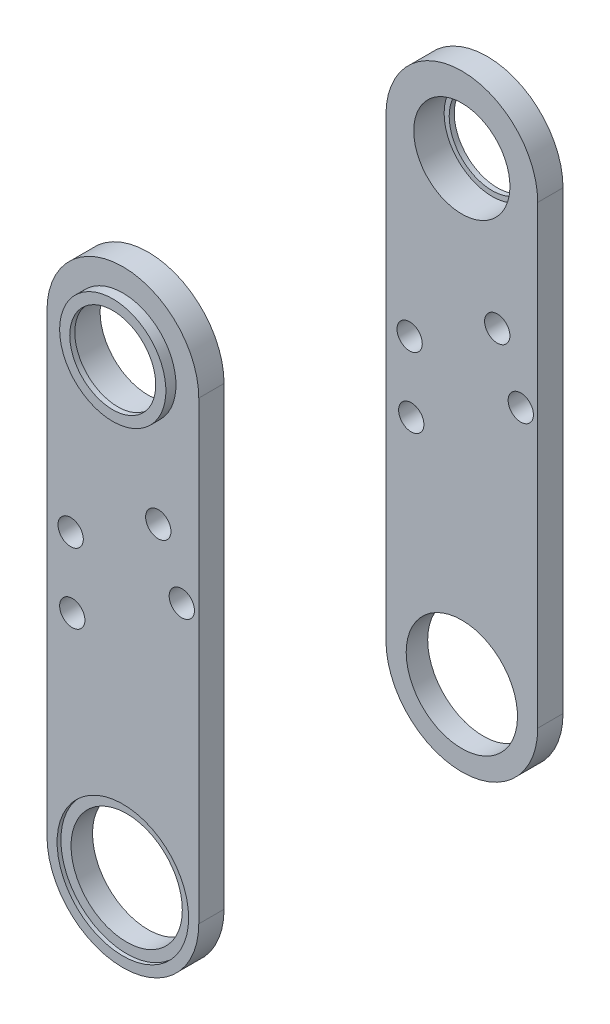
ISO-10303-21;
HEADER;
FILE_DESCRIPTION(('STEP AP214'),'2;1');
FILE_NAME('part.step','',(''),(''),'','','');
FILE_SCHEMA(('AUTOMOTIVE_DESIGN { 1 0 10303 214 1 1 1 1 }'));
ENDSEC;
DATA;
#1=APPLICATION_CONTEXT('core data for automotive mechanical design processes');
#2=APPLICATION_PROTOCOL_DEFINITION('international standard','automotive_design',2000,#1);
#3=PRODUCT_CONTEXT('',#1,'mechanical');
#4=PRODUCT('Part','Part','',(#3));
#5=PRODUCT_RELATED_PRODUCT_CATEGORY('part','',(#4));
#6=PRODUCT_DEFINITION_FORMATION('','',#4);
#7=PRODUCT_DEFINITION_CONTEXT('part definition',#1,'design');
#8=PRODUCT_DEFINITION('design','',#6,#7);
#9=PRODUCT_DEFINITION_SHAPE('','',#8);
#10=(LENGTH_UNIT() NAMED_UNIT(*) SI_UNIT(.MILLI.,.METRE.));
#11=(NAMED_UNIT(*) PLANE_ANGLE_UNIT() SI_UNIT($,.RADIAN.));
#12=(NAMED_UNIT(*) SI_UNIT($,.STERADIAN.) SOLID_ANGLE_UNIT());
#13=UNCERTAINTY_MEASURE_WITH_UNIT(LENGTH_MEASURE(1.E-05),#10,'distance_accuracy_value','');
#14=(GEOMETRIC_REPRESENTATION_CONTEXT(3) GLOBAL_UNCERTAINTY_ASSIGNED_CONTEXT((#13)) GLOBAL_UNIT_ASSIGNED_CONTEXT((#10,
#11,#12)) REPRESENTATION_CONTEXT('',''));
#15=CARTESIAN_POINT('',(0.,0.,0.));
#16=DIRECTION('',(0.,0.,1.));
#17=DIRECTION('',(1.,0.,0.));
#18=AXIS2_PLACEMENT_3D('',#15,#16,#17);
#19=CARTESIAN_POINT('',(0.,90.,0.));
#20=DIRECTION('',(0.,0.,1.));
#21=DIRECTION('',(1.,0.,0.));
#22=AXIS2_PLACEMENT_3D('',#19,#20,#21);
#23=PLANE('',#22);
#24=CARTESIAN_POINT('',(0.,90.,0.));
#25=DIRECTION('',(0.,0.,1.));
#26=DIRECTION('',(1.,0.,0.));
#27=AXIS2_PLACEMENT_3D('',#24,#25,#26);
#28=CIRCLE('',#27,15.);
#29=CARTESIAN_POINT('',(15.,90.,0.));
#30=VERTEX_POINT('',#29);
#31=CARTESIAN_POINT('',(-15.,90.,0.));
#32=VERTEX_POINT('',#31);
#33=EDGE_CURVE('E78',#30,#32,#28,.T.);
#34=ORIENTED_EDGE('',*,*,#33,.F.);
#35=DIRECTION('',(0.,1.,0.));
#36=VECTOR('',#35,1.);
#37=CARTESIAN_POINT('',(15.,90.,0.));
#38=LINE('',#37,#36);
#39=CARTESIAN_POINT('',(15.,0.,0.));
#40=VERTEX_POINT('',#39);
#41=EDGE_CURVE('E115',#40,#30,#38,.T.);
#42=ORIENTED_EDGE('',*,*,#41,.F.);
#43=CARTESIAN_POINT('',(0.,0.,0.));
#44=DIRECTION('',(0.,0.,1.));
#45=DIRECTION('',(1.,0.,0.));
#46=AXIS2_PLACEMENT_3D('',#43,#44,#45);
#47=CIRCLE('',#46,15.);
#48=CARTESIAN_POINT('',(-15.,0.,0.));
#49=VERTEX_POINT('',#48);
#50=EDGE_CURVE('E132',#49,#40,#47,.T.);
#51=ORIENTED_EDGE('',*,*,#50,.F.);
#52=DIRECTION('',(0.,-1.,0.));
#53=VECTOR('',#52,1.);
#54=CARTESIAN_POINT('',(-15.,90.,0.));
#55=LINE('',#54,#53);
#56=EDGE_CURVE('E130',#32,#49,#55,.T.);
#57=ORIENTED_EDGE('',*,*,#56,.F.);
#58=EDGE_LOOP('',(#34,#42,#51,#57));
#59=FACE_BOUND('',#58,.T.);
#60=CARTESIAN_POINT('',(11.650635094611,53.21224929608,0.));
#61=DIRECTION('',(0.,0.,-1.));
#62=DIRECTION('',(0.,1.,0.));
#63=AXIS2_PLACEMENT_3D('',#60,#61,#62);
#64=CIRCLE('',#63,2.5);
#65=CARTESIAN_POINT('',(11.650635094611,55.71224929608,0.));
#66=VERTEX_POINT('',#65);
#67=EDGE_CURVE('E156',#66,#66,#64,.T.);
#68=ORIENTED_EDGE('',*,*,#67,.F.);
#69=EDGE_LOOP('',(#68));
#70=FACE_BOUND('',#69,.T.);
#71=CARTESIAN_POINT('',(-10.,40.71224929608,0.));
#72=DIRECTION('',(0.,0.,-1.));
#73=DIRECTION('',(0.,1.,0.));
#74=AXIS2_PLACEMENT_3D('',#71,#72,#73);
#75=CIRCLE('',#74,2.5);
#76=CARTESIAN_POINT('',(-10.,43.21224929608,0.));
#77=VERTEX_POINT('',#76);
#78=EDGE_CURVE('E151',#77,#77,#75,.T.);
#79=ORIENTED_EDGE('',*,*,#78,.F.);
#80=EDGE_LOOP('',(#79));
#81=FACE_BOUND('',#80,.T.);
#82=CARTESIAN_POINT('',(-10.3205080756888,54.4114817289327,0.));
#83=DIRECTION('',(0.,0.,-1.));
#84=DIRECTION('',(0.,1.,0.));
#85=AXIS2_PLACEMENT_3D('',#82,#83,#84);
#86=CIRCLE('',#85,2.5);
#87=CARTESIAN_POINT('',(-10.3205080756888,56.9114817289327,0.));
#88=VERTEX_POINT('',#87);
#89=EDGE_CURVE('E160',#88,#88,#86,.T.);
#90=ORIENTED_EDGE('',*,*,#89,.F.);
#91=EDGE_LOOP('',(#90));
#92=FACE_BOUND('',#91,.T.);
#93=CARTESIAN_POINT('',(7.,64.4114817289327,0.));
#94=DIRECTION('',(0.,0.,-1.));
#95=DIRECTION('',(0.,1.,0.));
#96=AXIS2_PLACEMENT_3D('',#93,#94,#95);
#97=CIRCLE('',#96,2.5);
#98=CARTESIAN_POINT('',(7.,66.9114817289327,0.));
#99=VERTEX_POINT('',#98);
#100=EDGE_CURVE('E149',#99,#99,#97,.T.);
#101=ORIENTED_EDGE('',*,*,#100,.F.);
#102=EDGE_LOOP('',(#101));
#103=FACE_BOUND('',#102,.T.);
#104=CARTESIAN_POINT('',(0.,0.,0.));
#105=DIRECTION('',(0.,0.,-1.));
#106=DIRECTION('',(-1.,0.,0.));
#107=AXIS2_PLACEMENT_3D('',#104,#105,#106);
#108=CIRCLE('',#107,13.);
#109=CARTESIAN_POINT('',(-13.,0.,0.));
#110=VERTEX_POINT('',#109);
#111=EDGE_CURVE('E177',#110,#110,#108,.T.);
#112=ORIENTED_EDGE('',*,*,#111,.F.);
#113=EDGE_LOOP('',(#112));
#114=FACE_BOUND('',#113,.T.);
#115=CARTESIAN_POINT('',(0.,90.,0.));
#116=DIRECTION('',(0.,0.,1.));
#117=DIRECTION('',(1.,0.,0.));
#118=AXIS2_PLACEMENT_3D('',#115,#116,#117);
#119=CIRCLE('',#118,10.5);
#120=CARTESIAN_POINT('',(10.5,90.,0.));
#121=VERTEX_POINT('',#120);
#122=EDGE_CURVE('E13',#121,#121,#119,.F.);
#123=ORIENTED_EDGE('',*,*,#122,.F.);
#124=EDGE_LOOP('',(#123));
#125=FACE_BOUND('',#124,.T.);
#126=ADVANCED_FACE('F69',(#59,#70,#81,#92,#103,#114,#125),#23,.F.);
#127=CARTESIAN_POINT('',(0.,0.,72.));
#128=DIRECTION('',(0.,0.,-1.));
#129=DIRECTION('',(-1.,0.,0.));
#130=AXIS2_PLACEMENT_3D('',#127,#128,#129);
#131=CYLINDRICAL_SURFACE('',#130,11.);
#132=CARTESIAN_POINT('',(0.,0.,5.00000000000002));
#133=DIRECTION('',(0.,0.,-1.));
#134=DIRECTION('',(0.,1.,0.));
#135=AXIS2_PLACEMENT_3D('',#132,#133,#134);
#136=CIRCLE('',#135,11.);
#137=CARTESIAN_POINT('',(0.,11.,5.00000000000002));
#138=VERTEX_POINT('',#137);
#139=EDGE_CURVE('E126',#138,#138,#136,.T.);
#140=ORIENTED_EDGE('',*,*,#139,.F.);
#141=EDGE_LOOP('',(#140));
#142=FACE_BOUND('',#141,.T.);
#143=CARTESIAN_POINT('',(0.,0.,0.750000000000001));
#144=DIRECTION('',(0.,0.,-1.));
#145=DIRECTION('',(-1.,0.,0.));
#146=AXIS2_PLACEMENT_3D('',#143,#144,#145);
#147=CIRCLE('',#146,11.);
#148=CARTESIAN_POINT('',(-11.,0.,0.750000000000001));
#149=VERTEX_POINT('',#148);
#150=EDGE_CURVE('E168',#149,#149,#147,.T.);
#151=ORIENTED_EDGE('',*,*,#150,.T.);
#152=EDGE_LOOP('',(#151));
#153=FACE_BOUND('',#152,.T.);
#154=ADVANCED_FACE('F224',(#142,#153),#131,.F.);
#155=CARTESIAN_POINT('',(11.650635094611,53.21224929608,72.));
#156=DIRECTION('',(0.,0.,-1.));
#157=DIRECTION('',(0.,1.,0.));
#158=AXIS2_PLACEMENT_3D('',#155,#156,#157);
#159=CYLINDRICAL_SURFACE('',#158,2.5);
#160=CARTESIAN_POINT('',(11.650635094611,53.21224929608,4.99999999999999));
#161=DIRECTION('',(0.,0.,-1.));
#162=DIRECTION('',(-1.,0.,0.));
#163=AXIS2_PLACEMENT_3D('',#160,#161,#162);
#164=CIRCLE('',#163,2.5);
#165=CARTESIAN_POINT('',(9.15063509461096,53.21224929608,4.99999999999999));
#166=VERTEX_POINT('',#165);
#167=EDGE_CURVE('E159',#166,#166,#164,.F.);
#168=ORIENTED_EDGE('',*,*,#167,.T.);
#169=EDGE_LOOP('',(#168));
#170=FACE_BOUND('',#169,.T.);
#171=ORIENTED_EDGE('',*,*,#67,.T.);
#172=EDGE_LOOP('',(#171));
#173=FACE_BOUND('',#172,.T.);
#174=ADVANCED_FACE('F232',(#170,#173),#159,.F.);
#175=CARTESIAN_POINT('',(-10.,40.71224929608,72.));
#176=DIRECTION('',(0.,0.,-1.));
#177=DIRECTION('',(0.,1.,0.));
#178=AXIS2_PLACEMENT_3D('',#175,#176,#177);
#179=CYLINDRICAL_SURFACE('',#178,2.5);
#180=CARTESIAN_POINT('',(-10.,40.71224929608,4.99999999999999));
#181=DIRECTION('',(0.,0.,-1.));
#182=DIRECTION('',(-1.,0.,0.));
#183=AXIS2_PLACEMENT_3D('',#180,#181,#182);
#184=CIRCLE('',#183,2.5);
#185=CARTESIAN_POINT('',(-12.5,40.71224929608,4.99999999999999));
#186=VERTEX_POINT('',#185);
#187=EDGE_CURVE('E155',#186,#186,#184,.F.);
#188=ORIENTED_EDGE('',*,*,#187,.T.);
#189=EDGE_LOOP('',(#188));
#190=FACE_BOUND('',#189,.T.);
#191=ORIENTED_EDGE('',*,*,#78,.T.);
#192=EDGE_LOOP('',(#191));
#193=FACE_BOUND('',#192,.T.);
#194=ADVANCED_FACE('F245',(#190,#193),#179,.F.);
#195=CARTESIAN_POINT('',(-10.3205080756888,54.4114817289327,72.));
#196=DIRECTION('',(0.,0.,-1.));
#197=DIRECTION('',(0.,1.,0.));
#198=AXIS2_PLACEMENT_3D('',#195,#196,#197);
#199=CYLINDRICAL_SURFACE('',#198,2.5);
#200=CARTESIAN_POINT('',(-10.3205080756888,54.4114817289327,4.99999999999999));
#201=DIRECTION('',(0.,0.,-1.));
#202=DIRECTION('',(-1.,0.,0.));
#203=AXIS2_PLACEMENT_3D('',#200,#201,#202);
#204=CIRCLE('',#203,2.5);
#205=CARTESIAN_POINT('',(-12.8205080756888,54.4114817289327,4.99999999999999));
#206=VERTEX_POINT('',#205);
#207=EDGE_CURVE('E154',#206,#206,#204,.F.);
#208=ORIENTED_EDGE('',*,*,#207,.T.);
#209=EDGE_LOOP('',(#208));
#210=FACE_BOUND('',#209,.T.);
#211=ORIENTED_EDGE('',*,*,#89,.T.);
#212=EDGE_LOOP('',(#211));
#213=FACE_BOUND('',#212,.T.);
#214=ADVANCED_FACE('F248',(#210,#213),#199,.F.);
#215=CARTESIAN_POINT('',(7.,64.4114817289327,72.));
#216=DIRECTION('',(0.,0.,-1.));
#217=DIRECTION('',(0.,1.,0.));
#218=AXIS2_PLACEMENT_3D('',#215,#216,#217);
#219=CYLINDRICAL_SURFACE('',#218,2.5);
#220=CARTESIAN_POINT('',(7.,64.4114817289327,4.99999999999999));
#221=DIRECTION('',(0.,0.,-1.));
#222=DIRECTION('',(-1.,0.,0.));
#223=AXIS2_PLACEMENT_3D('',#220,#221,#222);
#224=CIRCLE('',#223,2.5);
#225=CARTESIAN_POINT('',(4.5,64.4114817289327,4.99999999999999));
#226=VERTEX_POINT('',#225);
#227=EDGE_CURVE('E163',#226,#226,#224,.F.);
#228=ORIENTED_EDGE('',*,*,#227,.T.);
#229=EDGE_LOOP('',(#228));
#230=FACE_BOUND('',#229,.T.);
#231=ORIENTED_EDGE('',*,*,#100,.T.);
#232=EDGE_LOOP('',(#231));
#233=FACE_BOUND('',#232,.T.);
#234=ADVANCED_FACE('F71',(#230,#233),#219,.F.);
#235=CARTESIAN_POINT('',(55.,115.,4.99999999999999));
#236=DIRECTION('',(0.,0.,-1.));
#237=DIRECTION('',(0.,1.,0.));
#238=AXIS2_PLACEMENT_3D('',#235,#236,#237);
#239=PLANE('',#238);
#240=CARTESIAN_POINT('',(0.,90.,4.99999999999999));
#241=DIRECTION('',(0.,0.,-1.));
#242=DIRECTION('',(0.,1.,0.));
#243=AXIS2_PLACEMENT_3D('',#240,#241,#242);
#244=CIRCLE('',#243,15.);
#245=CARTESIAN_POINT('',(-15.,90.,5.));
#246=VERTEX_POINT('',#245);
#247=CARTESIAN_POINT('',(15.,90.,4.99999999999999));
#248=VERTEX_POINT('',#247);
#249=EDGE_CURVE('E122',#246,#248,#244,.T.);
#250=ORIENTED_EDGE('',*,*,#249,.F.);
#251=DIRECTION('',(0.,-1.,0.));
#252=VECTOR('',#251,1.);
#253=CARTESIAN_POINT('',(-15.,115.,4.99999999999999));
#254=LINE('',#253,#252);
#255=CARTESIAN_POINT('',(-15.,0.,5.00000000000002));
#256=VERTEX_POINT('',#255);
#257=EDGE_CURVE('E119',#246,#256,#254,.T.);
#258=ORIENTED_EDGE('',*,*,#257,.T.);
#259=CARTESIAN_POINT('',(0.,0.,5.00000000000002));
#260=DIRECTION('',(0.,0.,-1.));
#261=DIRECTION('',(0.,1.,0.));
#262=AXIS2_PLACEMENT_3D('',#259,#260,#261);
#263=CIRCLE('',#262,15.);
#264=CARTESIAN_POINT('',(15.,0.,5.));
#265=VERTEX_POINT('',#264);
#266=EDGE_CURVE('E105',#265,#256,#263,.T.);
#267=ORIENTED_EDGE('',*,*,#266,.F.);
#268=DIRECTION('',(0.,-1.,0.));
#269=VECTOR('',#268,1.);
#270=CARTESIAN_POINT('',(15.,90.,4.99999999999999));
#271=LINE('',#270,#269);
#272=EDGE_CURVE('E140',#248,#265,#271,.T.);
#273=ORIENTED_EDGE('',*,*,#272,.F.);
#274=EDGE_LOOP('',(#250,#258,#267,#273));
#275=FACE_BOUND('',#274,.T.);
#276=ORIENTED_EDGE('',*,*,#139,.T.);
#277=EDGE_LOOP('',(#276));
#278=FACE_BOUND('',#277,.T.);
#279=CARTESIAN_POINT('',(0.,90.,4.99999999999999));
#280=DIRECTION('',(0.,0.,-1.));
#281=DIRECTION('',(0.,1.,0.));
#282=AXIS2_PLACEMENT_3D('',#279,#280,#281);
#283=CIRCLE('',#282,9.5);
#284=CARTESIAN_POINT('',(0.,99.5,4.99999999999999));
#285=VERTEX_POINT('',#284);
#286=EDGE_CURVE('E125',#285,#285,#283,.T.);
#287=ORIENTED_EDGE('',*,*,#286,.T.);
#288=EDGE_LOOP('',(#287));
#289=FACE_BOUND('',#288,.T.);
#290=ORIENTED_EDGE('',*,*,#167,.F.);
#291=EDGE_LOOP('',(#290));
#292=FACE_BOUND('',#291,.T.);
#293=ORIENTED_EDGE('',*,*,#187,.F.);
#294=EDGE_LOOP('',(#293));
#295=FACE_BOUND('',#294,.T.);
#296=ORIENTED_EDGE('',*,*,#227,.F.);
#297=EDGE_LOOP('',(#296));
#298=FACE_BOUND('',#297,.T.);
#299=ORIENTED_EDGE('',*,*,#207,.F.);
#300=EDGE_LOOP('',(#299));
#301=FACE_BOUND('',#300,.T.);
#302=ADVANCED_FACE('F120',(#275,#278,#289,#292,#295,#298,#301),#239,.F.);
#303=CARTESIAN_POINT('',(15.,90.,72.));
#304=DIRECTION('',(-1.,0.,0.));
#305=DIRECTION('',(0.,-1.,0.));
#306=AXIS2_PLACEMENT_3D('',#303,#304,#305);
#307=PLANE('',#306);
#308=DIRECTION('',(0.,0.,-1.));
#309=VECTOR('',#308,1.);
#310=CARTESIAN_POINT('',(15.,90.,72.));
#311=LINE('',#310,#309);
#312=EDGE_CURVE('E86',#248,#30,#311,.T.);
#313=ORIENTED_EDGE('',*,*,#312,.F.);
#314=ORIENTED_EDGE('',*,*,#272,.T.);
#315=DIRECTION('',(0.,0.,-1.));
#316=VECTOR('',#315,1.);
#317=CARTESIAN_POINT('',(15.,0.,72.));
#318=LINE('',#317,#316);
#319=EDGE_CURVE('E112',#265,#40,#318,.T.);
#320=ORIENTED_EDGE('',*,*,#319,.T.);
#321=ORIENTED_EDGE('',*,*,#41,.T.);
#322=EDGE_LOOP('',(#313,#314,#320,#321));
#323=FACE_BOUND('',#322,.T.);
#324=ADVANCED_FACE('F238',(#323),#307,.F.);
#325=CARTESIAN_POINT('',(0.,0.,72.));
#326=DIRECTION('',(0.,0.,-1.));
#327=DIRECTION('',(-1.,0.,0.));
#328=AXIS2_PLACEMENT_3D('',#325,#326,#327);
#329=CYLINDRICAL_SURFACE('',#328,15.);
#330=ORIENTED_EDGE('',*,*,#319,.F.);
#331=ORIENTED_EDGE('',*,*,#266,.T.);
#332=DIRECTION('',(0.,0.,-1.));
#333=VECTOR('',#332,1.);
#334=CARTESIAN_POINT('',(-15.,0.,72.));
#335=LINE('',#334,#333);
#336=EDGE_CURVE('E110',#256,#49,#335,.T.);
#337=ORIENTED_EDGE('',*,*,#336,.T.);
#338=ORIENTED_EDGE('',*,*,#50,.T.);
#339=EDGE_LOOP('',(#330,#331,#337,#338));
#340=FACE_BOUND('',#339,.T.);
#341=ADVANCED_FACE('F107',(#340),#329,.T.);
#342=CARTESIAN_POINT('',(-15.,90.,72.));
#343=DIRECTION('',(1.,0.,0.));
#344=DIRECTION('',(0.,1.,0.));
#345=AXIS2_PLACEMENT_3D('',#342,#343,#344);
#346=PLANE('',#345);
#347=ORIENTED_EDGE('',*,*,#336,.F.);
#348=ORIENTED_EDGE('',*,*,#257,.F.);
#349=DIRECTION('',(0.,0.,-1.));
#350=VECTOR('',#349,1.);
#351=CARTESIAN_POINT('',(-15.,90.,72.));
#352=LINE('',#351,#350);
#353=EDGE_CURVE('E134',#246,#32,#352,.T.);
#354=ORIENTED_EDGE('',*,*,#353,.T.);
#355=ORIENTED_EDGE('',*,*,#56,.T.);
#356=EDGE_LOOP('',(#347,#348,#354,#355));
#357=FACE_BOUND('',#356,.T.);
#358=ADVANCED_FACE('F128',(#357),#346,.F.);
#359=CARTESIAN_POINT('',(0.,90.,72.));
#360=DIRECTION('',(0.,0.,-1.));
#361=DIRECTION('',(-1.,0.,0.));
#362=AXIS2_PLACEMENT_3D('',#359,#360,#361);
#363=CYLINDRICAL_SURFACE('',#362,15.);
#364=ORIENTED_EDGE('',*,*,#353,.F.);
#365=ORIENTED_EDGE('',*,*,#249,.T.);
#366=ORIENTED_EDGE('',*,*,#312,.T.);
#367=ORIENTED_EDGE('',*,*,#33,.T.);
#368=EDGE_LOOP('',(#364,#365,#366,#367));
#369=FACE_BOUND('',#368,.T.);
#370=ADVANCED_FACE('F197',(#369),#363,.T.);
#371=CARTESIAN_POINT('',(0.,90.,72.));
#372=DIRECTION('',(0.,0.,-1.));
#373=DIRECTION('',(-1.,0.,0.));
#374=AXIS2_PLACEMENT_3D('',#371,#372,#373);
#375=CYLINDRICAL_SURFACE('',#374,9.5);
#376=ORIENTED_EDGE('',*,*,#286,.F.);
#377=EDGE_LOOP('',(#376));
#378=FACE_BOUND('',#377,.T.);
#379=CARTESIAN_POINT('',(0.,90.,-1.));
#380=DIRECTION('',(0.,0.,-1.));
#381=DIRECTION('',(-1.,0.,0.));
#382=AXIS2_PLACEMENT_3D('',#379,#380,#381);
#383=CIRCLE('',#382,9.49999999999999);
#384=CARTESIAN_POINT('',(-9.49999999999999,90.,-1.));
#385=VERTEX_POINT('',#384);
#386=EDGE_CURVE('E201',#385,#385,#383,.T.);
#387=ORIENTED_EDGE('',*,*,#386,.T.);
#388=EDGE_LOOP('',(#387));
#389=FACE_BOUND('',#388,.T.);
#390=ADVANCED_FACE('F193',(#378,#389),#375,.F.);
#391=CARTESIAN_POINT('',(0.,0.,0.75));
#392=DIRECTION('',(0.,0.,-1.));
#393=DIRECTION('',(-1.,0.,0.));
#394=AXIS2_PLACEMENT_3D('',#391,#392,#393);
#395=CYLINDRICAL_SURFACE('',#394,13.);
#396=CARTESIAN_POINT('',(0.,0.,0.75));
#397=DIRECTION('',(0.,0.,-1.));
#398=DIRECTION('',(-1.,0.,0.));
#399=AXIS2_PLACEMENT_3D('',#396,#397,#398);
#400=CIRCLE('',#399,13.);
#401=CARTESIAN_POINT('',(-13.,0.,0.75));
#402=VERTEX_POINT('',#401);
#403=EDGE_CURVE('E173',#402,#402,#400,.T.);
#404=ORIENTED_EDGE('',*,*,#403,.F.);
#405=EDGE_LOOP('',(#404));
#406=FACE_BOUND('',#405,.T.);
#407=ORIENTED_EDGE('',*,*,#111,.T.);
#408=EDGE_LOOP('',(#407));
#409=FACE_BOUND('',#408,.T.);
#410=ADVANCED_FACE('F196',(#406,#409),#395,.F.);
#411=CARTESIAN_POINT('',(0.,0.,0.75));
#412=DIRECTION('',(0.,0.,-1.));
#413=DIRECTION('',(-1.,0.,0.));
#414=AXIS2_PLACEMENT_3D('',#411,#412,#413);
#415=PLANE('',#414);
#416=ORIENTED_EDGE('',*,*,#150,.F.);
#417=EDGE_LOOP('',(#416));
#418=FACE_BOUND('',#417,.T.);
#419=ORIENTED_EDGE('',*,*,#403,.T.);
#420=EDGE_LOOP('',(#419));
#421=FACE_BOUND('',#420,.T.);
#422=ADVANCED_FACE('F219',(#418,#421),#415,.T.);
#423=CARTESIAN_POINT('',(0.,90.,67.));
#424=DIRECTION('',(0.,0.,-1.));
#425=DIRECTION('',(-1.,0.,0.));
#426=AXIS2_PLACEMENT_3D('',#423,#424,#425);
#427=CYLINDRICAL_SURFACE('',#426,10.5);
#428=CARTESIAN_POINT('',(0.,90.,-2.));
#429=DIRECTION('',(0.,0.,-1.));
#430=DIRECTION('',(-1.,0.,0.));
#431=AXIS2_PLACEMENT_3D('',#428,#429,#430);
#432=CIRCLE('',#431,10.5);
#433=CARTESIAN_POINT('',(-10.5,90.,-2.));
#434=VERTEX_POINT('',#433);
#435=EDGE_CURVE('E182',#434,#434,#432,.T.);
#436=ORIENTED_EDGE('',*,*,#435,.F.);
#437=EDGE_LOOP('',(#436));
#438=FACE_BOUND('',#437,.T.);
#439=ORIENTED_EDGE('',*,*,#122,.T.);
#440=EDGE_LOOP('',(#439));
#441=FACE_BOUND('',#440,.T.);
#442=ADVANCED_FACE('F216',(#438,#441),#427,.T.);
#443=CARTESIAN_POINT('',(0.,79.5,-2.));
#444=DIRECTION('',(0.,0.,1.));
#445=DIRECTION('',(1.,0.,0.));
#446=AXIS2_PLACEMENT_3D('',#443,#444,#445);
#447=PLANE('',#446);
#448=CARTESIAN_POINT('',(0.,90.,-2.));
#449=DIRECTION('',(0.,0.,-1.));
#450=DIRECTION('',(-1.,0.,0.));
#451=AXIS2_PLACEMENT_3D('',#448,#449,#450);
#452=CIRCLE('',#451,8.50000000000001);
#453=CARTESIAN_POINT('',(-8.50000000000001,90.,-2.));
#454=VERTEX_POINT('',#453);
#455=EDGE_CURVE('E206',#454,#454,#452,.T.);
#456=ORIENTED_EDGE('',*,*,#455,.F.);
#457=EDGE_LOOP('',(#456));
#458=FACE_BOUND('',#457,.T.);
#459=ORIENTED_EDGE('',*,*,#435,.T.);
#460=EDGE_LOOP('',(#459));
#461=FACE_BOUND('',#460,.T.);
#462=ADVANCED_FACE('F214',(#458,#461),#447,.F.);
#463=CARTESIAN_POINT('',(0.,90.,67.));
#464=DIRECTION('',(0.,0.,-1.));
#465=DIRECTION('',(-1.,0.,0.));
#466=AXIS2_PLACEMENT_3D('',#463,#464,#465);
#467=CYLINDRICAL_SURFACE('',#466,8.50000000000001);
#468=CARTESIAN_POINT('',(0.,90.,-1.));
#469=DIRECTION('',(0.,0.,-1.));
#470=DIRECTION('',(-1.,0.,0.));
#471=AXIS2_PLACEMENT_3D('',#468,#469,#470);
#472=CIRCLE('',#471,8.50000000000001);
#473=CARTESIAN_POINT('',(-8.50000000000001,90.,-1.));
#474=VERTEX_POINT('',#473);
#475=EDGE_CURVE('E203',#474,#474,#472,.T.);
#476=ORIENTED_EDGE('',*,*,#475,.F.);
#477=EDGE_LOOP('',(#476));
#478=FACE_BOUND('',#477,.T.);
#479=ORIENTED_EDGE('',*,*,#455,.T.);
#480=EDGE_LOOP('',(#479));
#481=FACE_BOUND('',#480,.T.);
#482=ADVANCED_FACE('F348',(#478,#481),#467,.F.);
#483=CARTESIAN_POINT('',(0.,81.5,-0.999999999999999));
#484=DIRECTION('',(0.,0.,-1.));
#485=DIRECTION('',(-1.,0.,0.));
#486=AXIS2_PLACEMENT_3D('',#483,#484,#485);
#487=PLANE('',#486);
#488=ORIENTED_EDGE('',*,*,#386,.F.);
#489=EDGE_LOOP('',(#488));
#490=FACE_BOUND('',#489,.T.);
#491=ORIENTED_EDGE('',*,*,#475,.T.);
#492=EDGE_LOOP('',(#491));
#493=FACE_BOUND('',#492,.T.);
#494=ADVANCED_FACE('F356',(#490,#493),#487,.F.);
#495=CLOSED_SHELL('',(#126,#154,#174,#194,#214,#234,#302,#324,#341,#358,#370,#390,#410,#422,
#442,#462,#482,#494));
#496=MANIFOLD_SOLID_BREP('B2',#495);
#497=CARTESIAN_POINT('',(0.,90.,72.));
#498=DIRECTION('',(0.,0.,1.));
#499=DIRECTION('',(1.,0.,0.));
#500=AXIS2_PLACEMENT_3D('',#497,#498,#499);
#501=PLANE('',#500);
#502=CARTESIAN_POINT('',(0.,90.,72.));
#503=DIRECTION('',(0.,0.,1.));
#504=DIRECTION('',(1.,0.,0.));
#505=AXIS2_PLACEMENT_3D('',#502,#503,#504);
#506=CIRCLE('',#505,15.);
#507=CARTESIAN_POINT('',(15.,90.,72.));
#508=VERTEX_POINT('',#507);
#509=CARTESIAN_POINT('',(-15.,90.,72.));
#510=VERTEX_POINT('',#509);
#511=EDGE_CURVE('E478',#508,#510,#506,.T.);
#512=ORIENTED_EDGE('',*,*,#511,.T.);
#513=DIRECTION('',(0.,-1.,0.));
#514=VECTOR('',#513,1.);
#515=CARTESIAN_POINT('',(-15.,90.,72.));
#516=LINE('',#515,#514);
#517=CARTESIAN_POINT('',(-15.,0.,72.));
#518=VERTEX_POINT('',#517);
#519=EDGE_CURVE('E532',#510,#518,#516,.T.);
#520=ORIENTED_EDGE('',*,*,#519,.T.);
#521=CARTESIAN_POINT('',(0.,0.,72.));
#522=DIRECTION('',(0.,0.,1.));
#523=DIRECTION('',(1.,0.,0.));
#524=AXIS2_PLACEMENT_3D('',#521,#522,#523);
#525=CIRCLE('',#524,15.);
#526=CARTESIAN_POINT('',(15.,0.,72.));
#527=VERTEX_POINT('',#526);
#528=EDGE_CURVE('E530',#518,#527,#525,.T.);
#529=ORIENTED_EDGE('',*,*,#528,.T.);
#530=DIRECTION('',(0.,1.,0.));
#531=VECTOR('',#530,1.);
#532=CARTESIAN_POINT('',(15.,90.,72.));
#533=LINE('',#532,#531);
#534=EDGE_CURVE('E464',#527,#508,#533,.T.);
#535=ORIENTED_EDGE('',*,*,#534,.T.);
#536=EDGE_LOOP('',(#512,#520,#529,#535));
#537=FACE_BOUND('',#536,.T.);
#538=CARTESIAN_POINT('',(11.650635094611,53.21224929608,72.));
#539=DIRECTION('',(0.,0.,-1.));
#540=DIRECTION('',(0.,1.,0.));
#541=AXIS2_PLACEMENT_3D('',#538,#539,#540);
#542=CIRCLE('',#541,2.5);
#543=CARTESIAN_POINT('',(11.650635094611,55.71224929608,72.));
#544=VERTEX_POINT('',#543);
#545=EDGE_CURVE('E485',#544,#544,#542,.T.);
#546=ORIENTED_EDGE('',*,*,#545,.T.);
#547=EDGE_LOOP('',(#546));
#548=FACE_BOUND('',#547,.T.);
#549=CARTESIAN_POINT('',(-10.,40.71224929608,72.));
#550=DIRECTION('',(0.,0.,-1.));
#551=DIRECTION('',(0.,1.,0.));
#552=AXIS2_PLACEMENT_3D('',#549,#550,#551);
#553=CIRCLE('',#552,2.5);
#554=CARTESIAN_POINT('',(-10.,43.2122492960801,72.));
#555=VERTEX_POINT('',#554);
#556=EDGE_CURVE('E520',#555,#555,#553,.T.);
#557=ORIENTED_EDGE('',*,*,#556,.T.);
#558=EDGE_LOOP('',(#557));
#559=FACE_BOUND('',#558,.T.);
#560=CARTESIAN_POINT('',(-10.3205080756888,54.4114817289327,72.));
#561=DIRECTION('',(0.,0.,-1.));
#562=DIRECTION('',(0.,1.,0.));
#563=AXIS2_PLACEMENT_3D('',#560,#561,#562);
#564=CIRCLE('',#563,2.5);
#565=CARTESIAN_POINT('',(-10.3205080756888,56.9114817289327,72.));
#566=VERTEX_POINT('',#565);
#567=EDGE_CURVE('E516',#566,#566,#564,.T.);
#568=ORIENTED_EDGE('',*,*,#567,.T.);
#569=EDGE_LOOP('',(#568));
#570=FACE_BOUND('',#569,.T.);
#571=CARTESIAN_POINT('',(7.,64.4114817289327,72.));
#572=DIRECTION('',(0.,0.,-1.));
#573=DIRECTION('',(0.,1.,0.));
#574=AXIS2_PLACEMENT_3D('',#571,#572,#573);
#575=CIRCLE('',#574,2.5);
#576=CARTESIAN_POINT('',(7.,66.9114817289327,72.));
#577=VERTEX_POINT('',#576);
#578=EDGE_CURVE('E480',#577,#577,#575,.T.);
#579=ORIENTED_EDGE('',*,*,#578,.T.);
#580=EDGE_LOOP('',(#579));
#581=FACE_BOUND('',#580,.T.);
#582=CARTESIAN_POINT('',(0.,0.,72.));
#583=DIRECTION('',(0.,0.,1.));
#584=DIRECTION('',(1.,0.,0.));
#585=AXIS2_PLACEMENT_3D('',#582,#583,#584);
#586=CIRCLE('',#585,13.);
#587=CARTESIAN_POINT('',(13.,0.,72.));
#588=VERTEX_POINT('',#587);
#589=EDGE_CURVE('E502',#588,#588,#586,.T.);
#590=ORIENTED_EDGE('',*,*,#589,.F.);
#591=EDGE_LOOP('',(#590));
#592=FACE_BOUND('',#591,.T.);
#593=CARTESIAN_POINT('',(0.,90.,72.));
#594=DIRECTION('',(0.,0.,-1.));
#595=DIRECTION('',(-1.,0.,0.));
#596=AXIS2_PLACEMENT_3D('',#593,#594,#595);
#597=CIRCLE('',#596,10.5);
#598=CARTESIAN_POINT('',(-10.5,90.,72.));
#599=VERTEX_POINT('',#598);
#600=EDGE_CURVE('E507',#599,#599,#597,.T.);
#601=ORIENTED_EDGE('',*,*,#600,.T.);
#602=EDGE_LOOP('',(#601));
#603=FACE_BOUND('',#602,.T.);
#604=ADVANCED_FACE('F418',(#537,#548,#559,#570,#581,#592,#603),#501,.T.);
#605=CARTESIAN_POINT('',(0.,0.,72.));
#606=DIRECTION('',(0.,0.,-1.));
#607=DIRECTION('',(-1.,0.,0.));
#608=AXIS2_PLACEMENT_3D('',#605,#606,#607);
#609=CYLINDRICAL_SURFACE('',#608,11.);
#610=CARTESIAN_POINT('',(0.,0.,67.));
#611=DIRECTION('',(0.,0.,-1.));
#612=DIRECTION('',(-1.,0.,0.));
#613=AXIS2_PLACEMENT_3D('',#610,#611,#612);
#614=CIRCLE('',#613,11.);
#615=CARTESIAN_POINT('',(-11.,0.,67.));
#616=VERTEX_POINT('',#615);
#617=EDGE_CURVE('E528',#616,#616,#614,.T.);
#618=ORIENTED_EDGE('',*,*,#617,.T.);
#619=EDGE_LOOP('',(#618));
#620=FACE_BOUND('',#619,.T.);
#621=CARTESIAN_POINT('',(0.,0.,71.25));
#622=DIRECTION('',(0.,0.,1.));
#623=DIRECTION('',(1.,0.,0.));
#624=AXIS2_PLACEMENT_3D('',#621,#622,#623);
#625=CIRCLE('',#624,11.);
#626=CARTESIAN_POINT('',(11.,0.,71.25));
#627=VERTEX_POINT('',#626);
#628=EDGE_CURVE('E422',#627,#627,#625,.T.);
#629=ORIENTED_EDGE('',*,*,#628,.T.);
#630=EDGE_LOOP('',(#629));
#631=FACE_BOUND('',#630,.T.);
#632=ADVANCED_FACE('F545',(#620,#631),#609,.F.);
#633=CARTESIAN_POINT('',(0.,0.,72.));
#634=DIRECTION('',(0.,0.,-1.));
#635=DIRECTION('',(-1.,0.,0.));
#636=AXIS2_PLACEMENT_3D('',#633,#634,#635);
#637=CYLINDRICAL_SURFACE('',#636,15.);
#638=CARTESIAN_POINT('',(0.,0.,67.));
#639=DIRECTION('',(0.,0.,-1.));
#640=DIRECTION('',(-1.,0.,0.));
#641=AXIS2_PLACEMENT_3D('',#638,#639,#640);
#642=CIRCLE('',#641,15.);
#643=CARTESIAN_POINT('',(15.,0.,67.));
#644=VERTEX_POINT('',#643);
#645=CARTESIAN_POINT('',(-15.,0.,67.));
#646=VERTEX_POINT('',#645);
#647=EDGE_CURVE('E427',#644,#646,#642,.T.);
#648=ORIENTED_EDGE('',*,*,#647,.F.);
#649=DIRECTION('',(0.,0.,-1.));
#650=VECTOR('',#649,1.);
#651=CARTESIAN_POINT('',(15.,0.,72.));
#652=LINE('',#651,#650);
#653=EDGE_CURVE('E474',#527,#644,#652,.T.);
#654=ORIENTED_EDGE('',*,*,#653,.F.);
#655=ORIENTED_EDGE('',*,*,#528,.F.);
#656=DIRECTION('',(0.,0.,-1.));
#657=VECTOR('',#656,1.);
#658=CARTESIAN_POINT('',(-15.,0.,72.));
#659=LINE('',#658,#657);
#660=EDGE_CURVE('E482',#518,#646,#659,.T.);
#661=ORIENTED_EDGE('',*,*,#660,.T.);
#662=EDGE_LOOP('',(#648,#654,#655,#661));
#663=FACE_BOUND('',#662,.T.);
#664=ADVANCED_FACE('F540',(#663),#637,.T.);
#665=CARTESIAN_POINT('',(0.,90.,72.));
#666=DIRECTION('',(0.,0.,-1.));
#667=DIRECTION('',(-1.,0.,0.));
#668=AXIS2_PLACEMENT_3D('',#665,#666,#667);
#669=CYLINDRICAL_SURFACE('',#668,15.);
#670=CARTESIAN_POINT('',(0.,90.,67.));
#671=DIRECTION('',(0.,0.,-1.));
#672=DIRECTION('',(-1.,0.,0.));
#673=AXIS2_PLACEMENT_3D('',#670,#671,#672);
#674=CIRCLE('',#673,15.);
#675=CARTESIAN_POINT('',(-15.,90.,67.));
#676=VERTEX_POINT('',#675);
#677=CARTESIAN_POINT('',(15.,90.,67.));
#678=VERTEX_POINT('',#677);
#679=EDGE_CURVE('E455',#676,#678,#674,.T.);
#680=ORIENTED_EDGE('',*,*,#679,.F.);
#681=DIRECTION('',(0.,0.,-1.));
#682=VECTOR('',#681,1.);
#683=CARTESIAN_POINT('',(-15.,90.,72.));
#684=LINE('',#683,#682);
#685=EDGE_CURVE('E479',#510,#676,#684,.T.);
#686=ORIENTED_EDGE('',*,*,#685,.F.);
#687=ORIENTED_EDGE('',*,*,#511,.F.);
#688=DIRECTION('',(0.,0.,-1.));
#689=VECTOR('',#688,1.);
#690=CARTESIAN_POINT('',(15.,90.,72.));
#691=LINE('',#690,#689);
#692=EDGE_CURVE('E471',#508,#678,#691,.T.);
#693=ORIENTED_EDGE('',*,*,#692,.T.);
#694=EDGE_LOOP('',(#680,#686,#687,#693));
#695=FACE_BOUND('',#694,.T.);
#696=ADVANCED_FACE('F476',(#695),#669,.T.);
#697=CARTESIAN_POINT('',(0.,90.,72.));
#698=DIRECTION('',(0.,0.,-1.));
#699=DIRECTION('',(-1.,0.,0.));
#700=AXIS2_PLACEMENT_3D('',#697,#698,#699);
#701=CYLINDRICAL_SURFACE('',#700,9.5);
#702=CARTESIAN_POINT('',(0.,90.,67.));
#703=DIRECTION('',(0.,0.,-1.));
#704=DIRECTION('',(-1.,0.,0.));
#705=AXIS2_PLACEMENT_3D('',#702,#703,#704);
#706=CIRCLE('',#705,9.5);
#707=CARTESIAN_POINT('',(-9.5,90.,67.));
#708=VERTEX_POINT('',#707);
#709=EDGE_CURVE('E525',#708,#708,#706,.T.);
#710=ORIENTED_EDGE('',*,*,#709,.T.);
#711=EDGE_LOOP('',(#710));
#712=FACE_BOUND('',#711,.T.);
#713=CARTESIAN_POINT('',(0.,90.,73.));
#714=DIRECTION('',(0.,0.,-1.));
#715=DIRECTION('',(-1.,0.,0.));
#716=AXIS2_PLACEMENT_3D('',#713,#714,#715);
#717=CIRCLE('',#716,9.49999999999999);
#718=CARTESIAN_POINT('',(-9.49999999999999,90.,73.));
#719=VERTEX_POINT('',#718);
#720=EDGE_CURVE('E571',#719,#719,#717,.T.);
#721=ORIENTED_EDGE('',*,*,#720,.F.);
#722=EDGE_LOOP('',(#721));
#723=FACE_BOUND('',#722,.T.);
#724=ADVANCED_FACE('F420',(#712,#723),#701,.F.);
#725=CARTESIAN_POINT('',(55.,115.,67.));
#726=DIRECTION('',(0.,0.,-1.));
#727=DIRECTION('',(-1.,0.,0.));
#728=AXIS2_PLACEMENT_3D('',#725,#726,#727);
#729=PLANE('',#728);
#730=ORIENTED_EDGE('',*,*,#647,.T.);
#731=DIRECTION('',(0.,-1.,0.));
#732=VECTOR('',#731,1.);
#733=CARTESIAN_POINT('',(-15.,115.,67.));
#734=LINE('',#733,#732);
#735=EDGE_CURVE('E67',#676,#646,#734,.T.);
#736=ORIENTED_EDGE('',*,*,#735,.F.);
#737=ORIENTED_EDGE('',*,*,#679,.T.);
#738=DIRECTION('',(0.,-1.,0.));
#739=VECTOR('',#738,1.);
#740=CARTESIAN_POINT('',(15.,90.,67.));
#741=LINE('',#740,#739);
#742=EDGE_CURVE('E459',#678,#644,#741,.T.);
#743=ORIENTED_EDGE('',*,*,#742,.T.);
#744=EDGE_LOOP('',(#730,#736,#737,#743));
#745=FACE_BOUND('',#744,.T.);
#746=ORIENTED_EDGE('',*,*,#709,.F.);
#747=EDGE_LOOP('',(#746));
#748=FACE_BOUND('',#747,.T.);
#749=CARTESIAN_POINT('',(11.650635094611,53.21224929608,67.));
#750=DIRECTION('',(0.,0.,1.));
#751=DIRECTION('',(1.,0.,0.));
#752=AXIS2_PLACEMENT_3D('',#749,#750,#751);
#753=CIRCLE('',#752,2.5);
#754=CARTESIAN_POINT('',(14.150635094611,53.21224929608,67.));
#755=VERTEX_POINT('',#754);
#756=EDGE_CURVE('E514',#755,#755,#753,.F.);
#757=ORIENTED_EDGE('',*,*,#756,.F.);
#758=EDGE_LOOP('',(#757));
#759=FACE_BOUND('',#758,.T.);
#760=CARTESIAN_POINT('',(-10.,40.71224929608,67.));
#761=DIRECTION('',(0.,0.,1.));
#762=DIRECTION('',(1.,0.,0.));
#763=AXIS2_PLACEMENT_3D('',#760,#761,#762);
#764=CIRCLE('',#763,2.5);
#765=CARTESIAN_POINT('',(-7.50000000000001,40.71224929608,67.));
#766=VERTEX_POINT('',#765);
#767=EDGE_CURVE('E495',#766,#766,#764,.F.);
#768=ORIENTED_EDGE('',*,*,#767,.F.);
#769=EDGE_LOOP('',(#768));
#770=FACE_BOUND('',#769,.T.);
#771=ORIENTED_EDGE('',*,*,#617,.F.);
#772=EDGE_LOOP('',(#771));
#773=FACE_BOUND('',#772,.T.);
#774=CARTESIAN_POINT('',(7.,64.4114817289327,67.));
#775=DIRECTION('',(0.,0.,1.));
#776=DIRECTION('',(1.,0.,0.));
#777=AXIS2_PLACEMENT_3D('',#774,#775,#776);
#778=CIRCLE('',#777,2.5);
#779=CARTESIAN_POINT('',(9.5,64.4114817289327,67.));
#780=VERTEX_POINT('',#779);
#781=EDGE_CURVE('E489',#780,#780,#778,.F.);
#782=ORIENTED_EDGE('',*,*,#781,.F.);
#783=EDGE_LOOP('',(#782));
#784=FACE_BOUND('',#783,.T.);
#785=CARTESIAN_POINT('',(-10.3205080756888,54.4114817289327,67.));
#786=DIRECTION('',(0.,0.,1.));
#787=DIRECTION('',(1.,0.,0.));
#788=AXIS2_PLACEMENT_3D('',#785,#786,#787);
#789=CIRCLE('',#788,2.5);
#790=CARTESIAN_POINT('',(-7.82050807568877,54.4114817289327,67.));
#791=VERTEX_POINT('',#790);
#792=EDGE_CURVE('E491',#791,#791,#789,.F.);
#793=ORIENTED_EDGE('',*,*,#792,.F.);
#794=EDGE_LOOP('',(#793));
#795=FACE_BOUND('',#794,.T.);
#796=ADVANCED_FACE('F457',(#745,#748,#759,#770,#773,#784,#795),#729,.T.);
#797=CARTESIAN_POINT('',(15.,90.,72.));
#798=DIRECTION('',(-1.,0.,0.));
#799=DIRECTION('',(0.,-1.,0.));
#800=AXIS2_PLACEMENT_3D('',#797,#798,#799);
#801=PLANE('',#800);
#802=ORIENTED_EDGE('',*,*,#742,.F.);
#803=ORIENTED_EDGE('',*,*,#692,.F.);
#804=ORIENTED_EDGE('',*,*,#534,.F.);
#805=ORIENTED_EDGE('',*,*,#653,.T.);
#806=EDGE_LOOP('',(#802,#803,#804,#805));
#807=FACE_BOUND('',#806,.T.);
#808=ADVANCED_FACE('F469',(#807),#801,.F.);
#809=CARTESIAN_POINT('',(-15.,90.,72.));
#810=DIRECTION('',(1.,0.,0.));
#811=DIRECTION('',(0.,1.,0.));
#812=AXIS2_PLACEMENT_3D('',#809,#810,#811);
#813=PLANE('',#812);
#814=ORIENTED_EDGE('',*,*,#685,.T.);
#815=ORIENTED_EDGE('',*,*,#735,.T.);
#816=ORIENTED_EDGE('',*,*,#660,.F.);
#817=ORIENTED_EDGE('',*,*,#519,.F.);
#818=EDGE_LOOP('',(#814,#815,#816,#817));
#819=FACE_BOUND('',#818,.T.);
#820=ADVANCED_FACE('F541',(#819),#813,.F.);
#821=CARTESIAN_POINT('',(11.650635094611,53.21224929608,72.));
#822=DIRECTION('',(0.,0.,-1.));
#823=DIRECTION('',(0.,1.,0.));
#824=AXIS2_PLACEMENT_3D('',#821,#822,#823);
#825=CYLINDRICAL_SURFACE('',#824,2.5);
#826=ORIENTED_EDGE('',*,*,#756,.T.);
#827=EDGE_LOOP('',(#826));
#828=FACE_BOUND('',#827,.T.);
#829=ORIENTED_EDGE('',*,*,#545,.F.);
#830=EDGE_LOOP('',(#829));
#831=FACE_BOUND('',#830,.T.);
#832=ADVANCED_FACE('F609',(#828,#831),#825,.F.);
#833=CARTESIAN_POINT('',(-10.,40.71224929608,72.));
#834=DIRECTION('',(0.,0.,-1.));
#835=DIRECTION('',(0.,1.,0.));
#836=AXIS2_PLACEMENT_3D('',#833,#834,#835);
#837=CYLINDRICAL_SURFACE('',#836,2.5);
#838=ORIENTED_EDGE('',*,*,#767,.T.);
#839=EDGE_LOOP('',(#838));
#840=FACE_BOUND('',#839,.T.);
#841=ORIENTED_EDGE('',*,*,#556,.F.);
#842=EDGE_LOOP('',(#841));
#843=FACE_BOUND('',#842,.T.);
#844=ADVANCED_FACE('F601',(#840,#843),#837,.F.);
#845=CARTESIAN_POINT('',(-10.3205080756888,54.4114817289327,72.));
#846=DIRECTION('',(0.,0.,-1.));
#847=DIRECTION('',(0.,1.,0.));
#848=AXIS2_PLACEMENT_3D('',#845,#846,#847);
#849=CYLINDRICAL_SURFACE('',#848,2.5);
#850=ORIENTED_EDGE('',*,*,#792,.T.);
#851=EDGE_LOOP('',(#850));
#852=FACE_BOUND('',#851,.T.);
#853=ORIENTED_EDGE('',*,*,#567,.F.);
#854=EDGE_LOOP('',(#853));
#855=FACE_BOUND('',#854,.T.);
#856=ADVANCED_FACE('F597',(#852,#855),#849,.F.);
#857=CARTESIAN_POINT('',(7.,64.4114817289327,72.));
#858=DIRECTION('',(0.,0.,-1.));
#859=DIRECTION('',(0.,1.,0.));
#860=AXIS2_PLACEMENT_3D('',#857,#858,#859);
#861=CYLINDRICAL_SURFACE('',#860,2.5);
#862=ORIENTED_EDGE('',*,*,#781,.T.);
#863=EDGE_LOOP('',(#862));
#864=FACE_BOUND('',#863,.T.);
#865=ORIENTED_EDGE('',*,*,#578,.F.);
#866=EDGE_LOOP('',(#865));
#867=FACE_BOUND('',#866,.T.);
#868=ADVANCED_FACE('F600',(#864,#867),#861,.F.);
#869=CARTESIAN_POINT('',(0.,0.,71.25));
#870=DIRECTION('',(0.,0.,1.));
#871=DIRECTION('',(1.,0.,0.));
#872=AXIS2_PLACEMENT_3D('',#869,#870,#871);
#873=CYLINDRICAL_SURFACE('',#872,13.);
#874=CARTESIAN_POINT('',(0.,0.,71.25));
#875=DIRECTION('',(0.,0.,1.));
#876=DIRECTION('',(1.,0.,0.));
#877=AXIS2_PLACEMENT_3D('',#874,#875,#876);
#878=CIRCLE('',#877,13.);
#879=CARTESIAN_POINT('',(13.,0.,71.25));
#880=VERTEX_POINT('',#879);
#881=EDGE_CURVE('E498',#880,#880,#878,.T.);
#882=ORIENTED_EDGE('',*,*,#881,.F.);
#883=EDGE_LOOP('',(#882));
#884=FACE_BOUND('',#883,.T.);
#885=ORIENTED_EDGE('',*,*,#589,.T.);
#886=EDGE_LOOP('',(#885));
#887=FACE_BOUND('',#886,.T.);
#888=ADVANCED_FACE('F607',(#884,#887),#873,.F.);
#889=CARTESIAN_POINT('',(0.,0.,71.25));
#890=DIRECTION('',(0.,0.,1.));
#891=DIRECTION('',(1.,0.,0.));
#892=AXIS2_PLACEMENT_3D('',#889,#890,#891);
#893=PLANE('',#892);
#894=ORIENTED_EDGE('',*,*,#628,.F.);
#895=EDGE_LOOP('',(#894));
#896=FACE_BOUND('',#895,.T.);
#897=ORIENTED_EDGE('',*,*,#881,.T.);
#898=EDGE_LOOP('',(#897));
#899=FACE_BOUND('',#898,.T.);
#900=ADVANCED_FACE('F663',(#896,#899),#893,.T.);
#901=CARTESIAN_POINT('',(0.,90.,67.));
#902=DIRECTION('',(0.,0.,-1.));
#903=DIRECTION('',(-1.,0.,0.));
#904=AXIS2_PLACEMENT_3D('',#901,#902,#903);
#905=CYLINDRICAL_SURFACE('',#904,10.5);
#906=ORIENTED_EDGE('',*,*,#600,.F.);
#907=EDGE_LOOP('',(#906));
#908=FACE_BOUND('',#907,.T.);
#909=CARTESIAN_POINT('',(0.,90.,74.));
#910=DIRECTION('',(0.,0.,-1.));
#911=DIRECTION('',(-1.,0.,0.));
#912=AXIS2_PLACEMENT_3D('',#909,#910,#911);
#913=CIRCLE('',#912,10.5);
#914=CARTESIAN_POINT('',(-10.5,90.,74.));
#915=VERTEX_POINT('',#914);
#916=EDGE_CURVE('E560',#915,#915,#913,.T.);
#917=ORIENTED_EDGE('',*,*,#916,.T.);
#918=EDGE_LOOP('',(#917));
#919=FACE_BOUND('',#918,.T.);
#920=ADVANCED_FACE('F671',(#908,#919),#905,.T.);
#921=CARTESIAN_POINT('',(0.,79.5,74.));
#922=DIRECTION('',(0.,0.,-1.));
#923=DIRECTION('',(-1.,0.,0.));
#924=AXIS2_PLACEMENT_3D('',#921,#922,#923);
#925=PLANE('',#924);
#926=ORIENTED_EDGE('',*,*,#916,.F.);
#927=EDGE_LOOP('',(#926));
#928=FACE_BOUND('',#927,.T.);
#929=CARTESIAN_POINT('',(0.,90.,74.));
#930=DIRECTION('',(0.,0.,-1.));
#931=DIRECTION('',(-1.,0.,0.));
#932=AXIS2_PLACEMENT_3D('',#929,#930,#931);
#933=CIRCLE('',#932,8.50000000000001);
#934=CARTESIAN_POINT('',(-8.50000000000001,90.,74.));
#935=VERTEX_POINT('',#934);
#936=EDGE_CURVE('E562',#935,#935,#933,.T.);
#937=ORIENTED_EDGE('',*,*,#936,.T.);
#938=EDGE_LOOP('',(#937));
#939=FACE_BOUND('',#938,.T.);
#940=ADVANCED_FACE('F690',(#928,#939),#925,.F.);
#941=CARTESIAN_POINT('',(0.,90.,67.));
#942=DIRECTION('',(0.,0.,-1.));
#943=DIRECTION('',(-1.,0.,0.));
#944=AXIS2_PLACEMENT_3D('',#941,#942,#943);
#945=CYLINDRICAL_SURFACE('',#944,8.50000000000001);
#946=ORIENTED_EDGE('',*,*,#936,.F.);
#947=EDGE_LOOP('',(#946));
#948=FACE_BOUND('',#947,.T.);
#949=CARTESIAN_POINT('',(0.,90.,73.));
#950=DIRECTION('',(0.,0.,-1.));
#951=DIRECTION('',(-1.,0.,0.));
#952=AXIS2_PLACEMENT_3D('',#949,#950,#951);
#953=CIRCLE('',#952,8.50000000000001);
#954=CARTESIAN_POINT('',(-8.50000000000001,90.,73.));
#955=VERTEX_POINT('',#954);
#956=EDGE_CURVE('E566',#955,#955,#953,.T.);
#957=ORIENTED_EDGE('',*,*,#956,.T.);
#958=EDGE_LOOP('',(#957));
#959=FACE_BOUND('',#958,.T.);
#960=ADVANCED_FACE('F699',(#948,#959),#945,.F.);
#961=CARTESIAN_POINT('',(0.,81.5,73.));
#962=DIRECTION('',(0.,0.,1.));
#963=DIRECTION('',(1.,0.,0.));
#964=AXIS2_PLACEMENT_3D('',#961,#962,#963);
#965=PLANE('',#964);
#966=ORIENTED_EDGE('',*,*,#956,.F.);
#967=EDGE_LOOP('',(#966));
#968=FACE_BOUND('',#967,.T.);
#969=ORIENTED_EDGE('',*,*,#720,.T.);
#970=EDGE_LOOP('',(#969));
#971=FACE_BOUND('',#970,.T.);
#972=ADVANCED_FACE('F575',(#968,#971),#965,.F.);
#973=CLOSED_SHELL('',(#604,#632,#664,#696,#724,#796,#808,#820,#832,#844,#856,#868,#888,#900,
#920,#940,#960,#972));
#974=MANIFOLD_SOLID_BREP('B7',#973);
#975=ADVANCED_BREP_SHAPE_REPRESENTATION('',(#18,#496,#974),#14);
#976=SHAPE_DEFINITION_REPRESENTATION(#9,#975);
ENDSEC;
END-ISO-10303-21;
